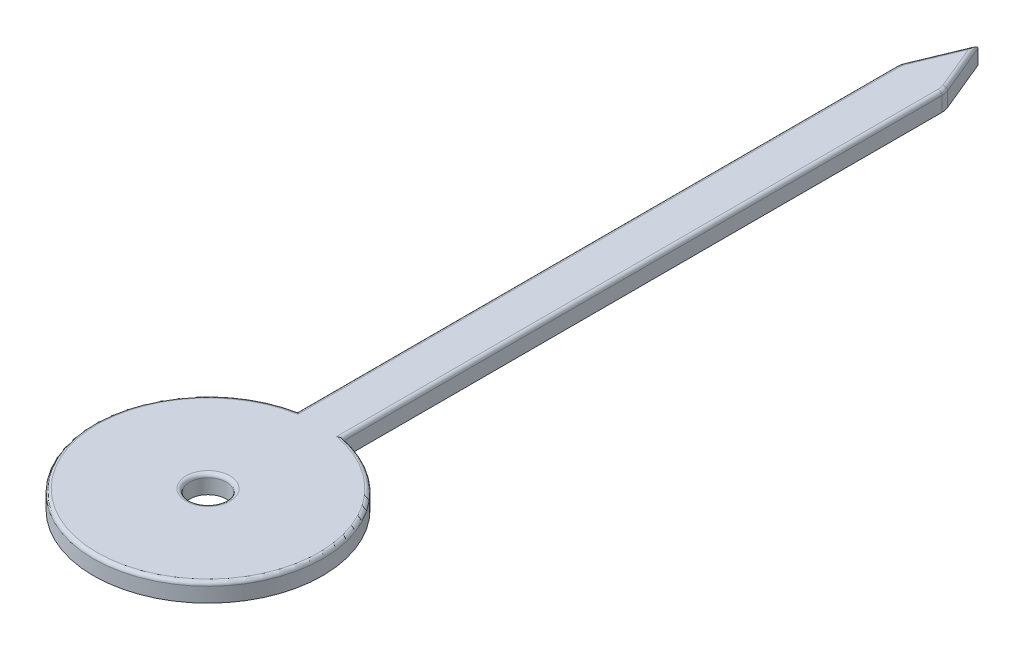
ISO-10303-21;
HEADER;
FILE_DESCRIPTION(('STEP AP214'),'2;1');
FILE_NAME('part.step','',(''),(''),'','','');
FILE_SCHEMA(('AUTOMOTIVE_DESIGN { 1 0 10303 214 1 1 1 1 }'));
ENDSEC;
DATA;
#1=APPLICATION_CONTEXT('core data for automotive mechanical design processes');
#2=APPLICATION_PROTOCOL_DEFINITION('international standard','automotive_design',2000,#1);
#3=PRODUCT_CONTEXT('',#1,'mechanical');
#4=PRODUCT('Part','Part','',(#3));
#5=PRODUCT_RELATED_PRODUCT_CATEGORY('part','',(#4));
#6=PRODUCT_DEFINITION_FORMATION('','',#4);
#7=PRODUCT_DEFINITION_CONTEXT('part definition',#1,'design');
#8=PRODUCT_DEFINITION('design','',#6,#7);
#9=PRODUCT_DEFINITION_SHAPE('','',#8);
#10=(LENGTH_UNIT() NAMED_UNIT(*) SI_UNIT(.MILLI.,.METRE.));
#11=(NAMED_UNIT(*) PLANE_ANGLE_UNIT() SI_UNIT($,.RADIAN.));
#12=(NAMED_UNIT(*) SI_UNIT($,.STERADIAN.) SOLID_ANGLE_UNIT());
#13=UNCERTAINTY_MEASURE_WITH_UNIT(LENGTH_MEASURE(1.E-05),#10,'distance_accuracy_value','');
#14=(GEOMETRIC_REPRESENTATION_CONTEXT(3) GLOBAL_UNCERTAINTY_ASSIGNED_CONTEXT((#13)) GLOBAL_UNIT_ASSIGNED_CONTEXT((#10,
#11,#12)) REPRESENTATION_CONTEXT('',''));
#15=CARTESIAN_POINT('',(0.,0.,0.));
#16=DIRECTION('',(0.,0.,1.));
#17=DIRECTION('',(1.,0.,0.));
#18=AXIS2_PLACEMENT_3D('',#15,#16,#17);
#19=CARTESIAN_POINT('',(0.,0.1,0.));
#20=DIRECTION('',(0.,1.,0.));
#21=DIRECTION('',(0.,0.,1.));
#22=AXIS2_PLACEMENT_3D('',#19,#20,#21);
#23=PLANE('',#22);
#24=CARTESIAN_POINT('',(0.,0.1,0.));
#25=DIRECTION('',(0.,1.,0.));
#26=DIRECTION('',(0.,0.,1.));
#27=AXIS2_PLACEMENT_3D('',#24,#25,#26);
#28=CIRCLE('',#27,0.12);
#29=CARTESIAN_POINT('',(0.,0.1,0.12));
#30=VERTEX_POINT('',#29);
#31=EDGE_CURVE('E188',#30,#30,#28,.F.);
#32=ORIENTED_EDGE('',*,*,#31,.T.);
#33=EDGE_LOOP('',(#32));
#34=FACE_BOUND('',#33,.T.);
#35=CARTESIAN_POINT('',(0.0250000000000001,0.1,-3.8783320679654));
#36=DIRECTION('',(0.,1.,0.));
#37=DIRECTION('',(0.,0.,1.));
#38=AXIS2_PLACEMENT_3D('',#35,#36,#37);
#39=CIRCLE('',#38,0.08);
#40=CARTESIAN_POINT('',(0.105,0.1,-3.8783320679654));
#41=VERTEX_POINT('',#40);
#42=CARTESIAN_POINT('',(0.098910362600903,0.1,-3.90894674255461));
#43=VERTEX_POINT('',#42);
#44=EDGE_CURVE('E183',#41,#43,#39,.T.);
#45=ORIENTED_EDGE('',*,*,#44,.T.);
#46=DIRECTION('',(-0.382683432365091,0.,-0.923879532511286));
#47=VECTOR('',#46,1.);
#48=CARTESIAN_POINT('',(-0.0184775906502256,0.1,-4.1923463313527));
#49=LINE('',#48,#47);
#50=CARTESIAN_POINT('',(0.,0.1,-4.14773748140495));
#51=VERTEX_POINT('',#50);
#52=EDGE_CURVE('E185',#43,#51,#49,.T.);
#53=ORIENTED_EDGE('',*,*,#52,.T.);
#54=DIRECTION('',(-0.382683432365091,0.,0.923879532511286));
#55=VECTOR('',#54,1.);
#56=CARTESIAN_POINT('',(-0.0989103626009033,0.1,-3.90894674255461));
#57=LINE('',#56,#55);
#58=CARTESIAN_POINT('',(-0.0989103626009033,0.1,-3.90894674255461));
#59=VERTEX_POINT('',#58);
#60=EDGE_CURVE('E173',#51,#59,#57,.T.);
#61=ORIENTED_EDGE('',*,*,#60,.T.);
#62=CARTESIAN_POINT('',(-0.0250000000000001,0.1,-3.8783320679654));
#63=DIRECTION('',(0.,1.,0.));
#64=DIRECTION('',(0.,0.,1.));
#65=AXIS2_PLACEMENT_3D('',#62,#63,#64);
#66=CIRCLE('',#65,0.08);
#67=CARTESIAN_POINT('',(-0.105,0.1,-3.8783320679654));
#68=VERTEX_POINT('',#67);
#69=EDGE_CURVE('E175',#59,#68,#66,.T.);
#70=ORIENTED_EDGE('',*,*,#69,.T.);
#71=DIRECTION('',(0.,0.,1.));
#72=VECTOR('',#71,1.);
#73=CARTESIAN_POINT('',(-0.105,0.1,-0.612372435695795));
#74=LINE('',#73,#72);
#75=CARTESIAN_POINT('',(-0.105,0.1,-0.59581876439065));
#76=VERTEX_POINT('',#75);
#77=EDGE_CURVE('E177',#68,#76,#74,.T.);
#78=ORIENTED_EDGE('',*,*,#77,.T.);
#79=CARTESIAN_POINT('',(0.,0.1,0.));
#80=DIRECTION('',(0.,1.,0.));
#81=DIRECTION('',(0.,0.,1.));
#82=AXIS2_PLACEMENT_3D('',#79,#80,#81);
#83=CIRCLE('',#82,0.605000000000001);
#84=CARTESIAN_POINT('',(0.105,0.1,-0.59581876439065));
#85=VERTEX_POINT('',#84);
#86=EDGE_CURVE('E179',#76,#85,#83,.T.);
#87=ORIENTED_EDGE('',*,*,#86,.T.);
#88=DIRECTION('',(0.,0.,-1.));
#89=VECTOR('',#88,1.);
#90=CARTESIAN_POINT('',(0.105,0.1,-3.8783320679654));
#91=LINE('',#90,#89);
#92=EDGE_CURVE('E181',#85,#41,#91,.T.);
#93=ORIENTED_EDGE('',*,*,#92,.T.);
#94=EDGE_LOOP('',(#45,#53,#61,#70,#78,#87,#93));
#95=FACE_BOUND('',#94,.T.);
#96=ADVANCED_FACE('F33',(#34,#95),#23,.T.);
#97=CARTESIAN_POINT('',(0.,0.,0.));
#98=DIRECTION('',(0.,1.,0.));
#99=DIRECTION('',(0.,0.,1.));
#100=AXIS2_PLACEMENT_3D('',#97,#98,#99);
#101=PLANE('',#100);
#102=DIRECTION('',(0.,0.,1.));
#103=VECTOR('',#102,1.);
#104=CARTESIAN_POINT('',(-0.125,0.,-0.612372435695795));
#105=LINE('',#104,#103);
#106=CARTESIAN_POINT('',(-0.125,0.,-3.8783320679654));
#107=VERTEX_POINT('',#106);
#108=CARTESIAN_POINT('',(-0.125,0.,-0.612372435695795));
#109=VERTEX_POINT('',#108);
#110=EDGE_CURVE('E145',#107,#109,#105,.T.);
#111=ORIENTED_EDGE('',*,*,#110,.F.);
#112=CARTESIAN_POINT('',(-0.0250000000000001,0.,-3.8783320679654));
#113=DIRECTION('',(0.,1.,0.));
#114=DIRECTION('',(0.,0.,1.));
#115=AXIS2_PLACEMENT_3D('',#112,#113,#114);
#116=CIRCLE('',#115,0.1);
#117=CARTESIAN_POINT('',(-0.117387953251129,0.,-3.91660041120191));
#118=VERTEX_POINT('',#117);
#119=EDGE_CURVE('E144',#107,#118,#116,.F.);
#120=ORIENTED_EDGE('',*,*,#119,.T.);
#121=DIRECTION('',(-0.382683432365091,0.,0.923879532511286));
#122=VECTOR('',#121,1.);
#123=CARTESIAN_POINT('',(-0.125,0.,-3.89822330470336));
#124=LINE('',#123,#122);
#125=CARTESIAN_POINT('',(0.,0.,-4.2));
#126=VERTEX_POINT('',#125);
#127=EDGE_CURVE('E123',#126,#118,#124,.T.);
#128=ORIENTED_EDGE('',*,*,#127,.F.);
#129=DIRECTION('',(-0.382683432365091,0.,-0.923879532511286));
#130=VECTOR('',#129,1.);
#131=CARTESIAN_POINT('',(0.125,0.,-3.89822330470336));
#132=LINE('',#131,#130);
#133=CARTESIAN_POINT('',(0.117387953251129,0.,-3.91660041120191));
#134=VERTEX_POINT('',#133);
#135=EDGE_CURVE('E132',#134,#126,#132,.T.);
#136=ORIENTED_EDGE('',*,*,#135,.F.);
#137=CARTESIAN_POINT('',(0.0250000000000001,0.,-3.8783320679654));
#138=DIRECTION('',(0.,1.,0.));
#139=DIRECTION('',(0.,0.,1.));
#140=AXIS2_PLACEMENT_3D('',#137,#138,#139);
#141=CIRCLE('',#140,0.1);
#142=CARTESIAN_POINT('',(0.125,0.,-3.8783320679654));
#143=VERTEX_POINT('',#142);
#144=EDGE_CURVE('E161',#134,#143,#141,.F.);
#145=ORIENTED_EDGE('',*,*,#144,.T.);
#146=DIRECTION('',(0.,0.,-1.));
#147=VECTOR('',#146,1.);
#148=CARTESIAN_POINT('',(0.125,0.,-0.612372435695795));
#149=LINE('',#148,#147);
#150=CARTESIAN_POINT('',(0.125,0.,-0.612372435695795));
#151=VERTEX_POINT('',#150);
#152=EDGE_CURVE('E154',#151,#143,#149,.T.);
#153=ORIENTED_EDGE('',*,*,#152,.F.);
#154=CARTESIAN_POINT('',(0.,0.,0.));
#155=DIRECTION('',(0.,1.,0.));
#156=DIRECTION('',(0.,0.,1.));
#157=AXIS2_PLACEMENT_3D('',#154,#155,#156);
#158=CIRCLE('',#157,0.625000000000001);
#159=EDGE_CURVE('E148',#109,#151,#158,.T.);
#160=ORIENTED_EDGE('',*,*,#159,.F.);
#161=EDGE_LOOP('',(#111,#120,#128,#136,#145,#153,#160));
#162=FACE_BOUND('',#161,.T.);
#163=CARTESIAN_POINT('',(0.,0.,0.));
#164=DIRECTION('',(0.,1.,0.));
#165=DIRECTION('',(0.,0.,1.));
#166=AXIS2_PLACEMENT_3D('',#163,#164,#165);
#167=CIRCLE('',#166,0.1);
#168=CARTESIAN_POINT('',(0.,0.,0.1));
#169=VERTEX_POINT('',#168);
#170=EDGE_CURVE('E138',#169,#169,#167,.T.);
#171=ORIENTED_EDGE('',*,*,#170,.T.);
#172=EDGE_LOOP('',(#171));
#173=FACE_BOUND('',#172,.T.);
#174=ADVANCED_FACE('F141',(#162,#173),#101,.F.);
#175=CARTESIAN_POINT('',(0.125,0.1,-3.89822330470336));
#176=DIRECTION('',(-0.923879532511286,0.,0.382683432365091));
#177=DIRECTION('',(0.382683432365091,0.,0.923879532511286));
#178=AXIS2_PLACEMENT_3D('',#175,#176,#177);
#179=PLANE('',#178);
#180=DIRECTION('',(0.,-1.,0.));
#181=VECTOR('',#180,1.);
#182=CARTESIAN_POINT('',(0.,0.1,-4.2));
#183=LINE('',#182,#181);
#184=CARTESIAN_POINT('',(0.,0.08,-4.2));
#185=VERTEX_POINT('',#184);
#186=EDGE_CURVE('E119',#185,#126,#183,.T.);
#187=ORIENTED_EDGE('',*,*,#186,.F.);
#188=DIRECTION('',(-0.382683432365091,0.,-0.923879532511286));
#189=VECTOR('',#188,1.);
#190=CARTESIAN_POINT('',(0.117387953251129,0.08,-3.91660041120191));
#191=LINE('',#190,#189);
#192=CARTESIAN_POINT('',(0.117387953251129,0.08,-3.91660041120191));
#193=VERTEX_POINT('',#192);
#194=EDGE_CURVE('E191',#185,#193,#191,.F.);
#195=ORIENTED_EDGE('',*,*,#194,.T.);
#196=DIRECTION('',(0.,-1.,0.));
#197=VECTOR('',#196,1.);
#198=CARTESIAN_POINT('',(0.117387953251129,0.1,-3.91660041120191));
#199=LINE('',#198,#197);
#200=EDGE_CURVE('E135',#193,#134,#199,.T.);
#201=ORIENTED_EDGE('',*,*,#200,.T.);
#202=ORIENTED_EDGE('',*,*,#135,.T.);
#203=EDGE_LOOP('',(#187,#195,#201,#202));
#204=FACE_BOUND('',#203,.T.);
#205=ADVANCED_FACE('F133',(#204),#179,.F.);
#206=CARTESIAN_POINT('',(-0.125,0.1,-3.89822330470336));
#207=DIRECTION('',(0.923879532511286,0.,0.382683432365091));
#208=DIRECTION('',(0.382683432365091,0.,-0.923879532511286));
#209=AXIS2_PLACEMENT_3D('',#206,#207,#208);
#210=PLANE('',#209);
#211=DIRECTION('',(0.,-1.,0.));
#212=VECTOR('',#211,1.);
#213=CARTESIAN_POINT('',(-0.117387953251129,0.1,-3.91660041120191));
#214=LINE('',#213,#212);
#215=CARTESIAN_POINT('',(-0.117387953251129,0.08,-3.91660041120191));
#216=VERTEX_POINT('',#215);
#217=EDGE_CURVE('E164',#118,#216,#214,.F.);
#218=ORIENTED_EDGE('',*,*,#217,.T.);
#219=DIRECTION('',(-0.382683432365091,0.,0.923879532511286));
#220=VECTOR('',#219,1.);
#221=CARTESIAN_POINT('',(0.,0.08,-4.2));
#222=LINE('',#221,#220);
#223=EDGE_CURVE('E11',#216,#185,#222,.F.);
#224=ORIENTED_EDGE('',*,*,#223,.T.);
#225=ORIENTED_EDGE('',*,*,#186,.T.);
#226=ORIENTED_EDGE('',*,*,#127,.T.);
#227=EDGE_LOOP('',(#218,#224,#225,#226));
#228=FACE_BOUND('',#227,.T.);
#229=ADVANCED_FACE('F121',(#228),#210,.F.);
#230=CARTESIAN_POINT('',(-0.125,0.1,-0.612372435695795));
#231=DIRECTION('',(1.,0.,0.));
#232=DIRECTION('',(0.,0.,-1.));
#233=AXIS2_PLACEMENT_3D('',#230,#231,#232);
#234=PLANE('',#233);
#235=DIRECTION('',(0.,-1.,0.));
#236=VECTOR('',#235,1.);
#237=CARTESIAN_POINT('',(-0.125,0.1,-0.612372435695795));
#238=LINE('',#237,#236);
#239=CARTESIAN_POINT('',(-0.125,0.08,-0.612372435695795));
#240=VERTEX_POINT('',#239);
#241=EDGE_CURVE('E129',#240,#109,#238,.T.);
#242=ORIENTED_EDGE('',*,*,#241,.F.);
#243=DIRECTION('',(0.,0.,1.));
#244=VECTOR('',#243,1.);
#245=CARTESIAN_POINT('',(-0.125,0.08,-3.8783320679654));
#246=LINE('',#245,#244);
#247=CARTESIAN_POINT('',(-0.125,0.08,-3.8783320679654));
#248=VERTEX_POINT('',#247);
#249=EDGE_CURVE('E61',#240,#248,#246,.F.);
#250=ORIENTED_EDGE('',*,*,#249,.T.);
#251=DIRECTION('',(0.,-1.,0.));
#252=VECTOR('',#251,1.);
#253=CARTESIAN_POINT('',(-0.125,0.1,-3.8783320679654));
#254=LINE('',#253,#252);
#255=EDGE_CURVE('E128',#248,#107,#254,.T.);
#256=ORIENTED_EDGE('',*,*,#255,.T.);
#257=ORIENTED_EDGE('',*,*,#110,.T.);
#258=EDGE_LOOP('',(#242,#250,#256,#257));
#259=FACE_BOUND('',#258,.T.);
#260=ADVANCED_FACE('F255',(#259),#234,.F.);
#261=CARTESIAN_POINT('',(0.,0.1,0.));
#262=DIRECTION('',(0.,-1.,0.));
#263=DIRECTION('',(0.,0.,-1.));
#264=AXIS2_PLACEMENT_3D('',#261,#262,#263);
#265=CYLINDRICAL_SURFACE('',#264,0.625000000000001);
#266=DIRECTION('',(0.,-1.,0.));
#267=VECTOR('',#266,1.);
#268=CARTESIAN_POINT('',(0.125,0.1,-0.612372435695795));
#269=LINE('',#268,#267);
#270=CARTESIAN_POINT('',(0.125,0.08,-0.612372435695795));
#271=VERTEX_POINT('',#270);
#272=EDGE_CURVE('E157',#271,#151,#269,.T.);
#273=ORIENTED_EDGE('',*,*,#272,.F.);
#274=CARTESIAN_POINT('',(0.,0.08,0.));
#275=DIRECTION('',(0.,1.,0.));
#276=DIRECTION('',(0.,0.,1.));
#277=AXIS2_PLACEMENT_3D('',#274,#275,#276);
#278=CIRCLE('',#277,0.625000000000001);
#279=EDGE_CURVE('E197',#271,#240,#278,.F.);
#280=ORIENTED_EDGE('',*,*,#279,.T.);
#281=ORIENTED_EDGE('',*,*,#241,.T.);
#282=ORIENTED_EDGE('',*,*,#159,.T.);
#283=EDGE_LOOP('',(#273,#280,#281,#282));
#284=FACE_BOUND('',#283,.T.);
#285=ADVANCED_FACE('F251',(#284),#265,.T.);
#286=CARTESIAN_POINT('',(0.125,0.1,-0.612372435695795));
#287=DIRECTION('',(-1.,0.,0.));
#288=DIRECTION('',(0.,0.,1.));
#289=AXIS2_PLACEMENT_3D('',#286,#287,#288);
#290=PLANE('',#289);
#291=DIRECTION('',(0.,-1.,0.));
#292=VECTOR('',#291,1.);
#293=CARTESIAN_POINT('',(0.125,0.1,-3.8783320679654));
#294=LINE('',#293,#292);
#295=CARTESIAN_POINT('',(0.125,0.08,-3.8783320679654));
#296=VERTEX_POINT('',#295);
#297=EDGE_CURVE('E167',#143,#296,#294,.F.);
#298=ORIENTED_EDGE('',*,*,#297,.T.);
#299=DIRECTION('',(0.,0.,-1.));
#300=VECTOR('',#299,1.);
#301=CARTESIAN_POINT('',(0.125,0.08,-0.612372435695795));
#302=LINE('',#301,#300);
#303=EDGE_CURVE('E195',#296,#271,#302,.F.);
#304=ORIENTED_EDGE('',*,*,#303,.T.);
#305=ORIENTED_EDGE('',*,*,#272,.T.);
#306=ORIENTED_EDGE('',*,*,#152,.T.);
#307=EDGE_LOOP('',(#298,#304,#305,#306));
#308=FACE_BOUND('',#307,.T.);
#309=ADVANCED_FACE('F248',(#308),#290,.F.);
#310=CARTESIAN_POINT('',(0.,0.1,0.));
#311=DIRECTION('',(0.,-1.,0.));
#312=DIRECTION('',(0.,0.,-1.));
#313=AXIS2_PLACEMENT_3D('',#310,#311,#312);
#314=CYLINDRICAL_SURFACE('',#313,0.1);
#315=CARTESIAN_POINT('',(0.,0.08,0.));
#316=DIRECTION('',(0.,1.,0.));
#317=DIRECTION('',(0.,0.,1.));
#318=AXIS2_PLACEMENT_3D('',#315,#316,#317);
#319=CIRCLE('',#318,0.1);
#320=CARTESIAN_POINT('',(0.,0.08,0.1));
#321=VERTEX_POINT('',#320);
#322=EDGE_CURVE('E170',#321,#321,#319,.T.);
#323=ORIENTED_EDGE('',*,*,#322,.T.);
#324=EDGE_LOOP('',(#323));
#325=FACE_BOUND('',#324,.T.);
#326=ORIENTED_EDGE('',*,*,#170,.F.);
#327=EDGE_LOOP('',(#326));
#328=FACE_BOUND('',#327,.T.);
#329=ADVANCED_FACE('F246',(#325,#328),#314,.F.);
#330=CARTESIAN_POINT('',(-0.0250000000000001,0.1,-3.8783320679654));
#331=DIRECTION('',(0.,-1.,0.));
#332=DIRECTION('',(0.,0.,-1.));
#333=AXIS2_PLACEMENT_3D('',#330,#331,#332);
#334=CYLINDRICAL_SURFACE('',#333,0.1);
#335=ORIENTED_EDGE('',*,*,#255,.F.);
#336=CARTESIAN_POINT('',(-0.0250000000000001,0.08,-3.8783320679654));
#337=DIRECTION('',(0.,1.,0.));
#338=DIRECTION('',(0.,0.,1.));
#339=AXIS2_PLACEMENT_3D('',#336,#337,#338);
#340=CIRCLE('',#339,0.1);
#341=EDGE_CURVE('E46',#248,#216,#340,.F.);
#342=ORIENTED_EDGE('',*,*,#341,.T.);
#343=ORIENTED_EDGE('',*,*,#217,.F.);
#344=ORIENTED_EDGE('',*,*,#119,.F.);
#345=EDGE_LOOP('',(#335,#342,#343,#344));
#346=FACE_BOUND('',#345,.T.);
#347=ADVANCED_FACE('F263',(#346),#334,.T.);
#348=CARTESIAN_POINT('',(0.0250000000000001,0.1,-3.8783320679654));
#349=DIRECTION('',(0.,-1.,0.));
#350=DIRECTION('',(0.,0.,-1.));
#351=AXIS2_PLACEMENT_3D('',#348,#349,#350);
#352=CYLINDRICAL_SURFACE('',#351,0.1);
#353=ORIENTED_EDGE('',*,*,#200,.F.);
#354=CARTESIAN_POINT('',(0.0250000000000001,0.08,-3.8783320679654));
#355=DIRECTION('',(0.,1.,0.));
#356=DIRECTION('',(0.,0.,1.));
#357=AXIS2_PLACEMENT_3D('',#354,#355,#356);
#358=CIRCLE('',#357,0.1);
#359=EDGE_CURVE('E193',#193,#296,#358,.F.);
#360=ORIENTED_EDGE('',*,*,#359,.T.);
#361=ORIENTED_EDGE('',*,*,#297,.F.);
#362=ORIENTED_EDGE('',*,*,#144,.F.);
#363=EDGE_LOOP('',(#353,#360,#361,#362));
#364=FACE_BOUND('',#363,.T.);
#365=ADVANCED_FACE('F233',(#364),#352,.T.);
#366=CARTESIAN_POINT('',(0.,0.08,0.));
#367=DIRECTION('',(0.,1.,0.));
#368=DIRECTION('',(0.,0.,1.));
#369=AXIS2_PLACEMENT_3D('',#366,#367,#368);
#370=TOROIDAL_SURFACE('',#369,0.12,0.02);
#371=ORIENTED_EDGE('',*,*,#31,.F.);
#372=EDGE_LOOP('',(#371));
#373=FACE_BOUND('',#372,.T.);
#374=ORIENTED_EDGE('',*,*,#322,.F.);
#375=EDGE_LOOP('',(#374));
#376=FACE_BOUND('',#375,.T.);
#377=ADVANCED_FACE('F225',(#373,#376),#370,.T.);
#378=CARTESIAN_POINT('',(0.,0.08,0.));
#379=DIRECTION('',(0.,1.,0.));
#380=DIRECTION('',(0.,0.,1.));
#381=AXIS2_PLACEMENT_3D('',#378,#379,#380);
#382=TOROIDAL_SURFACE('',#381,0.605000000000001,0.02);
#383=CARTESIAN_POINT('',(0.125,0.08,-0.612372435695795));
#384=CARTESIAN_POINT('',(0.125001455655169,0.0809467000931492,-0.612373598014908));
#385=CARTESIAN_POINT('',(0.124932885057518,0.0818916553678453,-0.612317637011507));
#386=CARTESIAN_POINT('',(0.124667994976258,0.0837448826422002,-0.612101310916542));
#387=CARTESIAN_POINT('',(0.124472543412886,0.0846533596622723,-0.61194165513808));
#388=CARTESIAN_POINT('',(0.123966364836768,0.0864123674252115,-0.611527926225375));
#389=CARTESIAN_POINT('',(0.123655849274312,0.0872630010928063,-0.611274026279886));
#390=CARTESIAN_POINT('',(0.122936498310423,0.0888924964842966,-0.610685340961826));
#391=CARTESIAN_POINT('',(0.122527497483347,0.0896712343674777,-0.61035041949301));
#392=CARTESIAN_POINT('',(0.121487234894111,0.0913780334616979,-0.60949771749979));
#393=CARTESIAN_POINT('',(0.120826531379903,0.0922759837250603,-0.608955558891838));
#394=CARTESIAN_POINT('',(0.119401696801963,0.0939204708766721,-0.607784535117781));
#395=CARTESIAN_POINT('',(0.118637396099713,0.0946667542959807,-0.607155527706152));
#396=CARTESIAN_POINT('',(0.116811565377428,0.0961947887354066,-0.605650291676102));
#397=CARTESIAN_POINT('',(0.115726526977082,0.0969285663195184,-0.604753990434422));
#398=CARTESIAN_POINT('',(0.113482014366379,0.0981574984545024,-0.602895413446569));
#399=CARTESIAN_POINT('',(0.112322504544239,0.0986525378648902,-0.60193310612151));
#400=CARTESIAN_POINT('',(0.110249101773615,0.0993217274504699,-0.600208011870175));
#401=CARTESIAN_POINT('',(0.109343660103896,0.0995445374744497,-0.599453284943593));
#402=CARTESIAN_POINT('',(0.107522326082753,0.0998617848292955,-0.597932188652762));
#403=CARTESIAN_POINT('',(0.106606454021343,0.09995643887337,-0.597165841164272));
#404=CARTESIAN_POINT('',(0.105460331605267,0.0999960269322304,-0.596204972785494));
#405=CARTESIAN_POINT('',(0.105230119987562,0.0999999974999685,-0.596011877581894));
#406=CARTESIAN_POINT('',(0.105,0.1,-0.59581876439065));
#407=B_SPLINE_CURVE_WITH_KNOTS('',3,(#383,#384,#385,#386,#387,#388,#389,#390,#391,#392,#393,
#394,#395,#396,#397,#398,#399,#400,#401,#402,#403,#404,#405,#406),.UNSPECIFIED.,.F.,.F.,(4,2,2,
2,2,2,2,2,2,2,2,4),(0.,0.0028332081188868,0.00564723723549609,0.0084561205200295,
0.0112697552060633,0.0149686743038561,0.0186737251824725,0.0234103183311797,0.0281491936016217,
0.0317414859026682,0.0353276959780369,0.0362290670526058),.UNSPECIFIED.);
#408=EDGE_CURVE('E213',#85,#271,#407,.F.);
#409=ORIENTED_EDGE('',*,*,#408,.F.);
#410=ORIENTED_EDGE('',*,*,#86,.F.);
#411=CARTESIAN_POINT('',(-0.125,0.08,-0.612372435695795));
#412=CARTESIAN_POINT('',(-0.125001455655169,0.0809467000931493,-0.612373598014908));
#413=CARTESIAN_POINT('',(-0.124932885057518,0.0818916553678453,-0.612317637011507));
#414=CARTESIAN_POINT('',(-0.124667994976258,0.0837448826422001,-0.612101310916542));
#415=CARTESIAN_POINT('',(-0.124472543412886,0.0846533596622723,-0.61194165513808));
#416=CARTESIAN_POINT('',(-0.123966364836768,0.0864123674252115,-0.611527926225375));
#417=CARTESIAN_POINT('',(-0.123655849274312,0.0872630010928063,-0.611274026279885));
#418=CARTESIAN_POINT('',(-0.122936498310423,0.0888924964842966,-0.610685340961826));
#419=CARTESIAN_POINT('',(-0.122527497483347,0.0896712343674778,-0.61035041949301));
#420=CARTESIAN_POINT('',(-0.121487234894111,0.091378033461698,-0.60949771749979));
#421=CARTESIAN_POINT('',(-0.120826531379903,0.0922759837250604,-0.608955558891838));
#422=CARTESIAN_POINT('',(-0.119401696801962,0.0939204708766721,-0.60778453511778));
#423=CARTESIAN_POINT('',(-0.118637396099713,0.0946667542959808,-0.607155527706152));
#424=CARTESIAN_POINT('',(-0.116811565377428,0.0961947887354067,-0.605650291676102));
#425=CARTESIAN_POINT('',(-0.115726526977081,0.0969285663195185,-0.604753990434422));
#426=CARTESIAN_POINT('',(-0.113482014366379,0.0981574984545025,-0.602895413446569));
#427=CARTESIAN_POINT('',(-0.112322504544239,0.0986525378648903,-0.60193310612151));
#428=CARTESIAN_POINT('',(-0.110249101773615,0.0993217274504699,-0.600208011870175));
#429=CARTESIAN_POINT('',(-0.109343660103895,0.0995445374744497,-0.599453284943593));
#430=CARTESIAN_POINT('',(-0.107522326082753,0.0998617848292955,-0.597932188652762));
#431=CARTESIAN_POINT('',(-0.106606454021343,0.09995643887337,-0.597165841164272));
#432=CARTESIAN_POINT('',(-0.105460331605267,0.0999960269322304,-0.596204972785494));
#433=CARTESIAN_POINT('',(-0.105230119987562,0.0999999974999685,-0.596011877581894));
#434=CARTESIAN_POINT('',(-0.105,0.1,-0.59581876439065));
#435=B_SPLINE_CURVE_WITH_KNOTS('',3,(#411,#412,#413,#414,#415,#416,#417,#418,#419,#420,#421,
#422,#423,#424,#425,#426,#427,#428,#429,#430,#431,#432,#433,#434),.UNSPECIFIED.,.F.,.F.,(4,2,2,
2,2,2,2,2,2,2,2,4),(0.,0.00283320811888679,0.00564723723549613,0.00845612052002952,
0.0112697552060633,0.0149686743038563,0.0186737251824726,0.0234103183311798,0.0281491936016219,
0.0317414859026681,0.0353276959780368,0.0362290670526058),.UNSPECIFIED.);
#436=EDGE_CURVE('E38',#240,#76,#435,.T.);
#437=ORIENTED_EDGE('',*,*,#436,.F.);
#438=ORIENTED_EDGE('',*,*,#279,.F.);
#439=EDGE_LOOP('',(#409,#410,#437,#438));
#440=FACE_BOUND('',#439,.T.);
#441=ADVANCED_FACE('F222',(#440),#382,.T.);
#442=CARTESIAN_POINT('',(-0.105,0.08,0.));
#443=DIRECTION('',(0.,0.,-1.));
#444=DIRECTION('',(-1.,0.,0.));
#445=AXIS2_PLACEMENT_3D('',#442,#443,#444);
#446=CYLINDRICAL_SURFACE('',#445,0.02);
#447=ORIENTED_EDGE('',*,*,#436,.T.);
#448=ORIENTED_EDGE('',*,*,#77,.F.);
#449=CARTESIAN_POINT('',(-0.105,0.08,-3.8783320679654));
#450=DIRECTION('',(0.,0.,-1.));
#451=DIRECTION('',(-1.,0.,0.));
#452=AXIS2_PLACEMENT_3D('',#449,#450,#451);
#453=CIRCLE('',#452,0.02);
#454=EDGE_CURVE('E211',#248,#68,#453,.T.);
#455=ORIENTED_EDGE('',*,*,#454,.F.);
#456=ORIENTED_EDGE('',*,*,#249,.F.);
#457=EDGE_LOOP('',(#447,#448,#455,#456));
#458=FACE_BOUND('',#457,.T.);
#459=ADVANCED_FACE('F35',(#458),#446,.T.);
#460=CARTESIAN_POINT('',(0.105,0.08,0.));
#461=DIRECTION('',(0.,0.,1.));
#462=DIRECTION('',(1.,0.,0.));
#463=AXIS2_PLACEMENT_3D('',#460,#461,#462);
#464=CYLINDRICAL_SURFACE('',#463,0.02);
#465=ORIENTED_EDGE('',*,*,#408,.T.);
#466=ORIENTED_EDGE('',*,*,#303,.F.);
#467=CARTESIAN_POINT('',(0.105,0.08,-3.8783320679654));
#468=DIRECTION('',(0.,0.,-1.));
#469=DIRECTION('',(-1.,0.,0.));
#470=AXIS2_PLACEMENT_3D('',#467,#468,#469);
#471=CIRCLE('',#470,0.02);
#472=EDGE_CURVE('E208',#41,#296,#471,.T.);
#473=ORIENTED_EDGE('',*,*,#472,.F.);
#474=ORIENTED_EDGE('',*,*,#92,.F.);
#475=EDGE_LOOP('',(#465,#466,#473,#474));
#476=FACE_BOUND('',#475,.T.);
#477=ADVANCED_FACE('F219',(#476),#464,.T.);
#478=CARTESIAN_POINT('',(-0.0250000000000001,0.08,-3.8783320679654));
#479=DIRECTION('',(0.,1.,0.));
#480=DIRECTION('',(0.,0.,1.));
#481=AXIS2_PLACEMENT_3D('',#478,#479,#480);
#482=TOROIDAL_SURFACE('',#481,0.08,0.02);
#483=ORIENTED_EDGE('',*,*,#454,.T.);
#484=ORIENTED_EDGE('',*,*,#69,.F.);
#485=CARTESIAN_POINT('',(-0.0989103626009031,0.08,-3.90894674255461));
#486=DIRECTION('',(0.382683432365073,0.,-0.923879532511294));
#487=DIRECTION('',(-0.923879532511294,0.,-0.382683432365073));
#488=AXIS2_PLACEMENT_3D('',#485,#486,#487);
#489=CIRCLE('',#488,0.02);
#490=EDGE_CURVE('E205',#216,#59,#489,.T.);
#491=ORIENTED_EDGE('',*,*,#490,.F.);
#492=ORIENTED_EDGE('',*,*,#341,.F.);
#493=EDGE_LOOP('',(#483,#484,#491,#492));
#494=FACE_BOUND('',#493,.T.);
#495=ADVANCED_FACE('F279',(#494),#482,.T.);
#496=CARTESIAN_POINT('',(0.0250000000000001,0.08,-3.8783320679654));
#497=DIRECTION('',(0.,1.,0.));
#498=DIRECTION('',(0.,0.,1.));
#499=AXIS2_PLACEMENT_3D('',#496,#497,#498);
#500=TOROIDAL_SURFACE('',#499,0.08,0.02);
#501=ORIENTED_EDGE('',*,*,#472,.T.);
#502=ORIENTED_EDGE('',*,*,#359,.F.);
#503=CARTESIAN_POINT('',(0.098910362600903,0.08,-3.90894674255461));
#504=DIRECTION('',(-0.382683432365071,0.,-0.923879532511295));
#505=DIRECTION('',(-0.923879532511295,0.,0.382683432365071));
#506=AXIS2_PLACEMENT_3D('',#503,#504,#505);
#507=CIRCLE('',#506,0.02);
#508=EDGE_CURVE('E203',#43,#193,#507,.T.);
#509=ORIENTED_EDGE('',*,*,#508,.F.);
#510=ORIENTED_EDGE('',*,*,#44,.F.);
#511=EDGE_LOOP('',(#501,#502,#509,#510));
#512=FACE_BOUND('',#511,.T.);
#513=ADVANCED_FACE('F276',(#512),#500,.T.);
#514=CARTESIAN_POINT('',(-1.46644664984153,0.08,-0.607422090860951));
#515=DIRECTION('',(0.382683432365091,0.,-0.923879532511286));
#516=DIRECTION('',(-0.923879532511286,0.,-0.382683432365091));
#517=AXIS2_PLACEMENT_3D('',#514,#515,#516);
#518=CYLINDRICAL_SURFACE('',#517,0.02);
#519=ORIENTED_EDGE('',*,*,#490,.T.);
#520=ORIENTED_EDGE('',*,*,#60,.F.);
#521=CARTESIAN_POINT('',(0.,0.08,-4.14773748140495));
#522=DIRECTION('',(1.,0.,0.));
#523=DIRECTION('',(0.,0.,-1.));
#524=AXIS2_PLACEMENT_3D('',#521,#522,#523);
#525=ELLIPSE('',#524,0.0522625185950549,0.02);
#526=EDGE_CURVE('E201',#185,#51,#525,.T.);
#527=ORIENTED_EDGE('',*,*,#526,.F.);
#528=ORIENTED_EDGE('',*,*,#223,.F.);
#529=EDGE_LOOP('',(#519,#520,#527,#528));
#530=FACE_BOUND('',#529,.T.);
#531=ADVANCED_FACE('F272',(#530),#518,.T.);
#532=CARTESIAN_POINT('',(1.46644664984153,0.08,-0.607422090860951));
#533=DIRECTION('',(0.382683432365091,0.,0.923879532511286));
#534=DIRECTION('',(0.923879532511286,0.,-0.382683432365091));
#535=AXIS2_PLACEMENT_3D('',#532,#533,#534);
#536=CYLINDRICAL_SURFACE('',#535,0.02);
#537=ORIENTED_EDGE('',*,*,#508,.T.);
#538=ORIENTED_EDGE('',*,*,#194,.F.);
#539=ORIENTED_EDGE('',*,*,#526,.T.);
#540=ORIENTED_EDGE('',*,*,#52,.F.);
#541=EDGE_LOOP('',(#537,#538,#539,#540));
#542=FACE_BOUND('',#541,.T.);
#543=ADVANCED_FACE('F269',(#542),#536,.T.);
#544=CLOSED_SHELL('',(#96,#174,#205,#229,#260,#285,#309,#329,#347,#365,#377,#441,#459,#477,#495,
#513,#531,#543));
#545=MANIFOLD_SOLID_BREP('B2',#544);
#546=ADVANCED_BREP_SHAPE_REPRESENTATION('',(#18,#545),#14);
#547=SHAPE_DEFINITION_REPRESENTATION(#9,#546);
ENDSEC;
END-ISO-10303-21;
